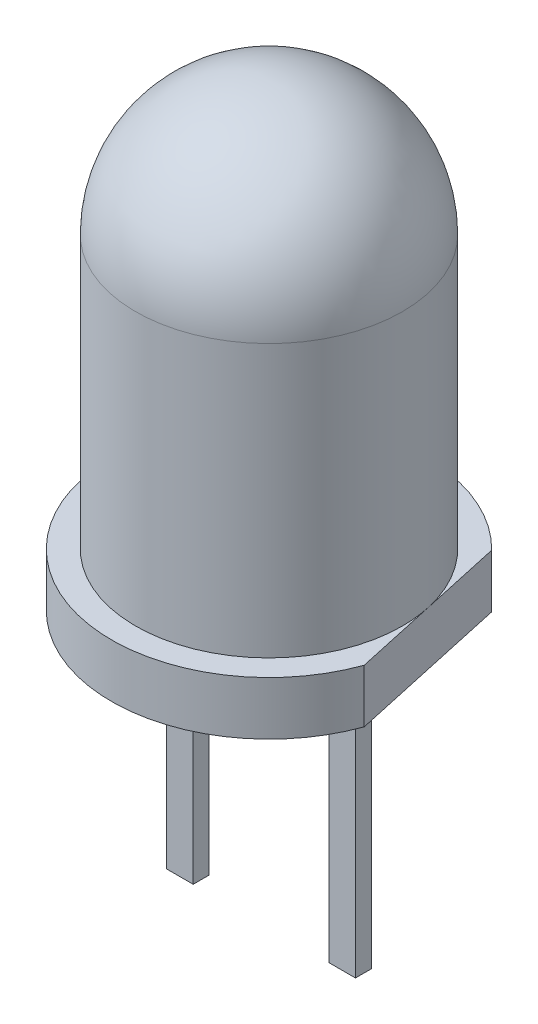
ISO-10303-21;
HEADER;
FILE_DESCRIPTION(('STEP AP214'),'2;1');
FILE_NAME('part.step','',(''),(''),'','','');
FILE_SCHEMA(('AUTOMOTIVE_DESIGN { 1 0 10303 214 1 1 1 1 }'));
ENDSEC;
DATA;
#1=APPLICATION_CONTEXT('core data for automotive mechanical design processes');
#2=APPLICATION_PROTOCOL_DEFINITION('international standard','automotive_design',2000,#1);
#3=PRODUCT_CONTEXT('',#1,'mechanical');
#4=PRODUCT('Part','Part','',(#3));
#5=PRODUCT_RELATED_PRODUCT_CATEGORY('part','',(#4));
#6=PRODUCT_DEFINITION_FORMATION('','',#4);
#7=PRODUCT_DEFINITION_CONTEXT('part definition',#1,'design');
#8=PRODUCT_DEFINITION('design','',#6,#7);
#9=PRODUCT_DEFINITION_SHAPE('','',#8);
#10=(LENGTH_UNIT() NAMED_UNIT(*) SI_UNIT(.MILLI.,.METRE.));
#11=(NAMED_UNIT(*) PLANE_ANGLE_UNIT() SI_UNIT($,.RADIAN.));
#12=(NAMED_UNIT(*) SI_UNIT($,.STERADIAN.) SOLID_ANGLE_UNIT());
#13=UNCERTAINTY_MEASURE_WITH_UNIT(LENGTH_MEASURE(1.E-05),#10,'distance_accuracy_value','');
#14=(GEOMETRIC_REPRESENTATION_CONTEXT(3) GLOBAL_UNCERTAINTY_ASSIGNED_CONTEXT((#13)) GLOBAL_UNIT_ASSIGNED_CONTEXT((#10,
#11,#12)) REPRESENTATION_CONTEXT('',''));
#15=CARTESIAN_POINT('',(0.,0.,0.));
#16=DIRECTION('',(0.,0.,1.));
#17=DIRECTION('',(1.,0.,0.));
#18=AXIS2_PLACEMENT_3D('',#15,#16,#17);
#19=CARTESIAN_POINT('',(0.,4.02324588999553,0.));
#20=DIRECTION('',(0.,-1.,0.));
#21=DIRECTION('',(1.,0.,0.));
#22=AXIS2_PLACEMENT_3D('',#19,#20,#21);
#23=SPHERICAL_SURFACE('',#22,2.5);
#24=CARTESIAN_POINT('',(0.,4.02324588999553,0.));
#25=DIRECTION('',(0.,-1.,0.));
#26=DIRECTION('',(1.,0.,0.));
#27=AXIS2_PLACEMENT_3D('',#24,#25,#26);
#28=CIRCLE('',#27,2.5);
#29=CARTESIAN_POINT('',(2.49999999999999,4.02324588999554,0.));
#30=VERTEX_POINT('',#29);
#31=EDGE_CURVE('E11',#30,#30,#28,.T.);
#32=ORIENTED_EDGE('',*,*,#31,.F.);
#33=EDGE_LOOP('',(#32));
#34=FACE_BOUND('',#33,.T.);
#35=ADVANCED_FACE('F33',(#34),#23,.T.);
#36=CARTESIAN_POINT('',(5.93600389952967E-13,-170.013908809735,0.));
#37=DIRECTION('',(0.,-1.,0.));
#38=DIRECTION('',(1.,0.,0.));
#39=AXIS2_PLACEMENT_3D('',#36,#37,#38);
#40=CYLINDRICAL_SURFACE('',#39,2.5);
#41=ORIENTED_EDGE('',*,*,#31,.T.);
#42=EDGE_LOOP('',(#41));
#43=FACE_BOUND('',#42,.T.);
#44=CARTESIAN_POINT('',(0.,-1.07675411000444,0.));
#45=DIRECTION('',(0.,-1.,0.));
#46=DIRECTION('',(1.,0.,0.));
#47=AXIS2_PLACEMENT_3D('',#44,#45,#46);
#48=CIRCLE('',#47,2.5);
#49=CARTESIAN_POINT('',(2.44180027093455,-1.07675411000444,-0.53629417008203));
#50=VERTEX_POINT('',#49);
#51=EDGE_CURVE('E40',#50,#50,#48,.T.);
#52=ORIENTED_EDGE('',*,*,#51,.F.);
#53=EDGE_LOOP('',(#52));
#54=FACE_BOUND('',#53,.T.);
#55=ADVANCED_FACE('F191',(#43,#54),#40,.T.);
#56=CARTESIAN_POINT('',(0.,-1.07675411000445,0.));
#57=DIRECTION('',(0.,-1.,0.));
#58=DIRECTION('',(1.,0.,0.));
#59=AXIS2_PLACEMENT_3D('',#56,#57,#58);
#60=PLANE('',#59);
#61=DIRECTION('',(0.214517668032812,0.,0.976720108373819));
#62=VECTOR('',#61,1.);
#63=CARTESIAN_POINT('',(2.10585574005865,-1.07675411000444,-2.06588276580789));
#64=LINE('',#63,#62);
#65=CARTESIAN_POINT('',(2.77774480181044,-1.07675411000444,0.993294425643827));
#66=VERTEX_POINT('',#65);
#67=EDGE_CURVE('E178',#50,#66,#64,.T.);
#68=ORIENTED_EDGE('',*,*,#67,.F.);
#69=ORIENTED_EDGE('',*,*,#51,.T.);
#70=CARTESIAN_POINT('',(2.10585574005865,-1.07675411000444,-2.06588276580789));
#71=VERTEX_POINT('',#70);
#72=EDGE_CURVE('E173',#71,#50,#64,.T.);
#73=ORIENTED_EDGE('',*,*,#72,.F.);
#74=CARTESIAN_POINT('',(0.,-1.07675411000445,0.));
#75=DIRECTION('',(0.,-1.,0.));
#76=DIRECTION('',(1.,0.,0.));
#77=AXIS2_PLACEMENT_3D('',#74,#75,#76);
#78=CIRCLE('',#77,2.95);
#79=EDGE_CURVE('E168',#66,#71,#78,.T.);
#80=ORIENTED_EDGE('',*,*,#79,.F.);
#81=EDGE_LOOP('',(#68,#69,#73,#80));
#82=FACE_BOUND('',#81,.T.);
#83=ADVANCED_FACE('F188',(#82),#60,.F.);
#84=CARTESIAN_POINT('',(0.,-2.07675411000445,0.));
#85=DIRECTION('',(0.,1.,0.));
#86=DIRECTION('',(-1.,0.,0.));
#87=AXIS2_PLACEMENT_3D('',#84,#85,#86);
#88=CYLINDRICAL_SURFACE('',#87,2.95);
#89=ORIENTED_EDGE('',*,*,#79,.T.);
#90=DIRECTION('',(0.,1.,0.));
#91=VECTOR('',#90,1.);
#92=CARTESIAN_POINT('',(2.10585574005866,-2.07675411000444,-2.06588276580789));
#93=LINE('',#92,#91);
#94=CARTESIAN_POINT('',(2.10585574005866,-2.07675411000444,-2.06588276580789));
#95=VERTEX_POINT('',#94);
#96=EDGE_CURVE('E183',#95,#71,#93,.T.);
#97=ORIENTED_EDGE('',*,*,#96,.F.);
#98=CARTESIAN_POINT('',(0.,-2.07675411000445,0.));
#99=DIRECTION('',(0.,-1.,0.));
#100=DIRECTION('',(1.,0.,0.));
#101=AXIS2_PLACEMENT_3D('',#98,#99,#100);
#102=CIRCLE('',#101,2.95);
#103=CARTESIAN_POINT('',(2.77774480181044,-2.07675411000444,0.993294425643827));
#104=VERTEX_POINT('',#103);
#105=EDGE_CURVE('E169',#104,#95,#102,.T.);
#106=ORIENTED_EDGE('',*,*,#105,.F.);
#107=DIRECTION('',(0.,1.,0.));
#108=VECTOR('',#107,1.);
#109=CARTESIAN_POINT('',(2.77774480181044,-2.07675411000444,0.993294425643827));
#110=LINE('',#109,#108);
#111=EDGE_CURVE('E175',#104,#66,#110,.T.);
#112=ORIENTED_EDGE('',*,*,#111,.T.);
#113=EDGE_LOOP('',(#89,#97,#106,#112));
#114=FACE_BOUND('',#113,.T.);
#115=ADVANCED_FACE('F198',(#114),#88,.T.);
#116=CARTESIAN_POINT('',(2.10585574005866,-2.07675411000444,-2.06588276580789));
#117=DIRECTION('',(-0.976720108373819,0.,0.214517668032812));
#118=DIRECTION('',(0.214517668032812,0.,0.976720108373819));
#119=AXIS2_PLACEMENT_3D('',#116,#117,#118);
#120=PLANE('',#119);
#121=ORIENTED_EDGE('',*,*,#72,.T.);
#122=ORIENTED_EDGE('',*,*,#67,.T.);
#123=ORIENTED_EDGE('',*,*,#111,.F.);
#124=DIRECTION('',(0.214517668032812,0.,0.976720108373819));
#125=VECTOR('',#124,1.);
#126=CARTESIAN_POINT('',(2.10585574005866,-2.07675411000444,-2.06588276580789));
#127=LINE('',#126,#125);
#128=EDGE_CURVE('E172',#95,#104,#127,.T.);
#129=ORIENTED_EDGE('',*,*,#128,.F.);
#130=ORIENTED_EDGE('',*,*,#96,.T.);
#131=EDGE_LOOP('',(#121,#122,#123,#129,#130));
#132=FACE_BOUND('',#131,.T.);
#133=ADVANCED_FACE('F204',(#132),#120,.F.);
#134=CARTESIAN_POINT('',(0.,-2.07675411000445,0.));
#135=DIRECTION('',(0.,-1.,0.));
#136=DIRECTION('',(1.,0.,0.));
#137=AXIS2_PLACEMENT_3D('',#134,#135,#136);
#138=PLANE('',#137);
#139=DIRECTION('',(-1.,0.,0.));
#140=VECTOR('',#139,1.);
#141=CARTESIAN_POINT('',(-1.27000000000329,-2.07675411000446,0.15));
#142=LINE('',#141,#140);
#143=CARTESIAN_POINT('',(-1.27000000000329,-2.07675411000446,0.15));
#144=VERTEX_POINT('',#143);
#145=CARTESIAN_POINT('',(-1.77000000000329,-2.07675411000446,0.15));
#146=VERTEX_POINT('',#145);
#147=EDGE_CURVE('E119',#144,#146,#142,.T.);
#148=ORIENTED_EDGE('',*,*,#147,.F.);
#149=DIRECTION('',(0.,0.,-1.));
#150=VECTOR('',#149,1.);
#151=CARTESIAN_POINT('',(-1.27000000000329,-2.07675411000446,0.15));
#152=LINE('',#151,#150);
#153=CARTESIAN_POINT('',(-1.27000000000329,-2.07675411000446,-0.15));
#154=VERTEX_POINT('',#153);
#155=EDGE_CURVE('E343',#144,#154,#152,.T.);
#156=ORIENTED_EDGE('',*,*,#155,.T.);
#157=DIRECTION('',(-1.,0.,0.));
#158=VECTOR('',#157,1.);
#159=CARTESIAN_POINT('',(-1.27000000000329,-2.07675411000446,-0.15));
#160=LINE('',#159,#158);
#161=CARTESIAN_POINT('',(-1.77000000000329,-2.07675411000445,-0.15));
#162=VERTEX_POINT('',#161);
#163=EDGE_CURVE('E134',#154,#162,#160,.T.);
#164=ORIENTED_EDGE('',*,*,#163,.T.);
#165=DIRECTION('',(0.,0.,-1.));
#166=VECTOR('',#165,1.);
#167=CARTESIAN_POINT('',(-1.77000000000329,-2.07675411000446,0.15));
#168=LINE('',#167,#166);
#169=EDGE_CURVE('E47',#146,#162,#168,.T.);
#170=ORIENTED_EDGE('',*,*,#169,.F.);
#171=EDGE_LOOP('',(#148,#156,#164,#170));
#172=FACE_BOUND('',#171,.T.);
#173=DIRECTION('',(-1.,0.,0.));
#174=VECTOR('',#173,1.);
#175=CARTESIAN_POINT('',(1.27000000000331,-2.07675411000446,0.15));
#176=LINE('',#175,#174);
#177=CARTESIAN_POINT('',(1.77000000000331,-2.07675411000446,0.15));
#178=VERTEX_POINT('',#177);
#179=CARTESIAN_POINT('',(1.27000000000331,-2.07675411000446,0.15));
#180=VERTEX_POINT('',#179);
#181=EDGE_CURVE('E150',#178,#180,#176,.T.);
#182=ORIENTED_EDGE('',*,*,#181,.F.);
#183=DIRECTION('',(0.,0.,-1.));
#184=VECTOR('',#183,1.);
#185=CARTESIAN_POINT('',(1.77000000000331,-2.07675411000446,0.15));
#186=LINE('',#185,#184);
#187=CARTESIAN_POINT('',(1.77000000000331,-2.07675411000446,-0.15));
#188=VERTEX_POINT('',#187);
#189=EDGE_CURVE('E159',#178,#188,#186,.T.);
#190=ORIENTED_EDGE('',*,*,#189,.T.);
#191=DIRECTION('',(-1.,0.,0.));
#192=VECTOR('',#191,1.);
#193=CARTESIAN_POINT('',(1.27000000000331,-2.07675411000446,-0.15));
#194=LINE('',#193,#192);
#195=CARTESIAN_POINT('',(1.27000000000331,-2.07675411000444,-0.15));
#196=VERTEX_POINT('',#195);
#197=EDGE_CURVE('E146',#188,#196,#194,.T.);
#198=ORIENTED_EDGE('',*,*,#197,.T.);
#199=DIRECTION('',(0.,0.,-1.));
#200=VECTOR('',#199,1.);
#201=CARTESIAN_POINT('',(1.27000000000331,-2.07675411000446,0.15));
#202=LINE('',#201,#200);
#203=EDGE_CURVE('E151',#180,#196,#202,.T.);
#204=ORIENTED_EDGE('',*,*,#203,.F.);
#205=EDGE_LOOP('',(#182,#190,#198,#204));
#206=FACE_BOUND('',#205,.T.);
#207=ORIENTED_EDGE('',*,*,#105,.T.);
#208=ORIENTED_EDGE('',*,*,#128,.T.);
#209=EDGE_LOOP('',(#207,#208));
#210=FACE_BOUND('',#209,.T.);
#211=ADVANCED_FACE('F131',(#172,#206,#210),#138,.T.);
#212=CARTESIAN_POINT('',(1.27000000000331,-2.07675411000446,0.15));
#213=DIRECTION('',(1.,0.,0.));
#214=DIRECTION('',(0.,1.,0.));
#215=AXIS2_PLACEMENT_3D('',#212,#213,#214);
#216=PLANE('',#215);
#217=DIRECTION('',(0.,-1.,0.));
#218=VECTOR('',#217,1.);
#219=CARTESIAN_POINT('',(1.27000000000331,-2.07675411000446,-0.15));
#220=LINE('',#219,#218);
#221=CARTESIAN_POINT('',(1.27000000000331,-7.07675411000446,-0.15));
#222=VERTEX_POINT('',#221);
#223=EDGE_CURVE('E55',#196,#222,#220,.T.);
#224=ORIENTED_EDGE('',*,*,#223,.T.);
#225=DIRECTION('',(0.,0.,-1.));
#226=VECTOR('',#225,1.);
#227=CARTESIAN_POINT('',(1.27000000000331,-7.07675411000446,0.15));
#228=LINE('',#227,#226);
#229=CARTESIAN_POINT('',(1.27000000000331,-7.07675411000446,0.15));
#230=VERTEX_POINT('',#229);
#231=EDGE_CURVE('E165',#230,#222,#228,.T.);
#232=ORIENTED_EDGE('',*,*,#231,.F.);
#233=DIRECTION('',(0.,-1.,0.));
#234=VECTOR('',#233,1.);
#235=CARTESIAN_POINT('',(1.27000000000331,-2.07675411000446,0.15));
#236=LINE('',#235,#234);
#237=EDGE_CURVE('E142',#180,#230,#236,.T.);
#238=ORIENTED_EDGE('',*,*,#237,.F.);
#239=ORIENTED_EDGE('',*,*,#203,.T.);
#240=EDGE_LOOP('',(#224,#232,#238,#239));
#241=FACE_BOUND('',#240,.T.);
#242=ADVANCED_FACE('F211',(#241),#216,.F.);
#243=CARTESIAN_POINT('',(1.27000000000331,-7.07675411000446,0.15));
#244=DIRECTION('',(0.,1.,0.));
#245=DIRECTION('',(0.,0.,1.));
#246=AXIS2_PLACEMENT_3D('',#243,#244,#245);
#247=PLANE('',#246);
#248=DIRECTION('',(1.,0.,0.));
#249=VECTOR('',#248,1.);
#250=CARTESIAN_POINT('',(1.27000000000331,-7.07675411000446,-0.15));
#251=LINE('',#250,#249);
#252=CARTESIAN_POINT('',(1.77000000000331,-7.07675411000446,-0.15));
#253=VERTEX_POINT('',#252);
#254=EDGE_CURVE('E136',#222,#253,#251,.T.);
#255=ORIENTED_EDGE('',*,*,#254,.T.);
#256=DIRECTION('',(0.,0.,-1.));
#257=VECTOR('',#256,1.);
#258=CARTESIAN_POINT('',(1.77000000000331,-7.07675411000446,0.15));
#259=LINE('',#258,#257);
#260=CARTESIAN_POINT('',(1.77000000000331,-7.07675411000446,0.15));
#261=VERTEX_POINT('',#260);
#262=EDGE_CURVE('E162',#261,#253,#259,.T.);
#263=ORIENTED_EDGE('',*,*,#262,.F.);
#264=DIRECTION('',(1.,0.,0.));
#265=VECTOR('',#264,1.);
#266=CARTESIAN_POINT('',(1.27000000000331,-7.07675411000446,0.15));
#267=LINE('',#266,#265);
#268=EDGE_CURVE('E145',#230,#261,#267,.T.);
#269=ORIENTED_EDGE('',*,*,#268,.F.);
#270=ORIENTED_EDGE('',*,*,#231,.T.);
#271=EDGE_LOOP('',(#255,#263,#269,#270));
#272=FACE_BOUND('',#271,.T.);
#273=ADVANCED_FACE('F214',(#272),#247,.F.);
#274=CARTESIAN_POINT('',(1.77000000000331,-2.07675411000446,0.15));
#275=DIRECTION('',(-1.,0.,0.));
#276=DIRECTION('',(0.,-1.,0.));
#277=AXIS2_PLACEMENT_3D('',#274,#275,#276);
#278=PLANE('',#277);
#279=DIRECTION('',(0.,1.,0.));
#280=VECTOR('',#279,1.);
#281=CARTESIAN_POINT('',(1.77000000000331,-2.07675411000446,-0.15));
#282=LINE('',#281,#280);
#283=EDGE_CURVE('E154',#253,#188,#282,.T.);
#284=ORIENTED_EDGE('',*,*,#283,.T.);
#285=ORIENTED_EDGE('',*,*,#189,.F.);
#286=DIRECTION('',(0.,1.,0.));
#287=VECTOR('',#286,1.);
#288=CARTESIAN_POINT('',(1.77000000000331,-2.07675411000446,0.15));
#289=LINE('',#288,#287);
#290=EDGE_CURVE('E148',#261,#178,#289,.T.);
#291=ORIENTED_EDGE('',*,*,#290,.F.);
#292=ORIENTED_EDGE('',*,*,#262,.T.);
#293=EDGE_LOOP('',(#284,#285,#291,#292));
#294=FACE_BOUND('',#293,.T.);
#295=ADVANCED_FACE('F218',(#294),#278,.F.);
#296=CARTESIAN_POINT('',(0.,0.,0.15));
#297=DIRECTION('',(0.,0.,1.));
#298=DIRECTION('',(1.,0.,0.));
#299=AXIS2_PLACEMENT_3D('',#296,#297,#298);
#300=PLANE('',#299);
#301=ORIENTED_EDGE('',*,*,#237,.T.);
#302=ORIENTED_EDGE('',*,*,#268,.T.);
#303=ORIENTED_EDGE('',*,*,#290,.T.);
#304=ORIENTED_EDGE('',*,*,#181,.T.);
#305=EDGE_LOOP('',(#301,#302,#303,#304));
#306=FACE_BOUND('',#305,.T.);
#307=ADVANCED_FACE('F222',(#306),#300,.T.);
#308=CARTESIAN_POINT('',(0.,0.,-0.15));
#309=DIRECTION('',(0.,0.,1.));
#310=DIRECTION('',(1.,0.,0.));
#311=AXIS2_PLACEMENT_3D('',#308,#309,#310);
#312=PLANE('',#311);
#313=ORIENTED_EDGE('',*,*,#223,.F.);
#314=ORIENTED_EDGE('',*,*,#197,.F.);
#315=ORIENTED_EDGE('',*,*,#283,.F.);
#316=ORIENTED_EDGE('',*,*,#254,.F.);
#317=EDGE_LOOP('',(#313,#314,#315,#316));
#318=FACE_BOUND('',#317,.T.);
#319=ADVANCED_FACE('F224',(#318),#312,.F.);
#320=CARTESIAN_POINT('',(-1.77000000000329,-2.07675411000446,0.15));
#321=DIRECTION('',(1.,0.,0.));
#322=DIRECTION('',(0.,1.,0.));
#323=AXIS2_PLACEMENT_3D('',#320,#321,#322);
#324=PLANE('',#323);
#325=DIRECTION('',(0.,-1.,0.));
#326=VECTOR('',#325,1.);
#327=CARTESIAN_POINT('',(-1.77000000000329,-2.07675411000446,-0.15));
#328=LINE('',#327,#326);
#329=CARTESIAN_POINT('',(-1.77000000000326,-7.07675411000446,-0.15));
#330=VERTEX_POINT('',#329);
#331=EDGE_CURVE('E341',#162,#330,#328,.T.);
#332=ORIENTED_EDGE('',*,*,#331,.T.);
#333=DIRECTION('',(0.,0.,-1.));
#334=VECTOR('',#333,1.);
#335=CARTESIAN_POINT('',(-1.77000000000326,-7.07675411000446,0.15));
#336=LINE('',#335,#334);
#337=CARTESIAN_POINT('',(-1.77000000000326,-7.07675411000446,0.15));
#338=VERTEX_POINT('',#337);
#339=EDGE_CURVE('E115',#338,#330,#336,.T.);
#340=ORIENTED_EDGE('',*,*,#339,.F.);
#341=DIRECTION('',(0.,-1.,0.));
#342=VECTOR('',#341,1.);
#343=CARTESIAN_POINT('',(-1.77000000000329,-2.07675411000446,0.15));
#344=LINE('',#343,#342);
#345=EDGE_CURVE('E111',#146,#338,#344,.T.);
#346=ORIENTED_EDGE('',*,*,#345,.F.);
#347=ORIENTED_EDGE('',*,*,#169,.T.);
#348=EDGE_LOOP('',(#332,#340,#346,#347));
#349=FACE_BOUND('',#348,.T.);
#350=ADVANCED_FACE('F113',(#349),#324,.F.);
#351=CARTESIAN_POINT('',(-1.27000000000326,-7.07675411000446,0.15));
#352=DIRECTION('',(0.,1.,0.));
#353=DIRECTION('',(0.,0.,1.));
#354=AXIS2_PLACEMENT_3D('',#351,#352,#353);
#355=PLANE('',#354);
#356=DIRECTION('',(1.,0.,0.));
#357=VECTOR('',#356,1.);
#358=CARTESIAN_POINT('',(-1.27000000000326,-7.07675411000446,-0.15));
#359=LINE('',#358,#357);
#360=CARTESIAN_POINT('',(-1.27000000000326,-7.07675411000446,-0.15));
#361=VERTEX_POINT('',#360);
#362=EDGE_CURVE('E349',#330,#361,#359,.T.);
#363=ORIENTED_EDGE('',*,*,#362,.T.);
#364=DIRECTION('',(0.,0.,-1.));
#365=VECTOR('',#364,1.);
#366=CARTESIAN_POINT('',(-1.27000000000326,-7.07675411000446,0.15));
#367=LINE('',#366,#365);
#368=CARTESIAN_POINT('',(-1.27000000000326,-7.07675411000446,0.15));
#369=VERTEX_POINT('',#368);
#370=EDGE_CURVE('E138',#369,#361,#367,.T.);
#371=ORIENTED_EDGE('',*,*,#370,.F.);
#372=DIRECTION('',(1.,0.,0.));
#373=VECTOR('',#372,1.);
#374=CARTESIAN_POINT('',(-1.27000000000326,-7.07675411000446,0.15));
#375=LINE('',#374,#373);
#376=EDGE_CURVE('E118',#338,#369,#375,.T.);
#377=ORIENTED_EDGE('',*,*,#376,.F.);
#378=ORIENTED_EDGE('',*,*,#339,.T.);
#379=EDGE_LOOP('',(#363,#371,#377,#378));
#380=FACE_BOUND('',#379,.T.);
#381=ADVANCED_FACE('F232',(#380),#355,.F.);
#382=CARTESIAN_POINT('',(-1.27000000000329,-2.07675411000446,0.15));
#383=DIRECTION('',(-1.,0.,0.));
#384=DIRECTION('',(0.,-1.,0.));
#385=AXIS2_PLACEMENT_3D('',#382,#383,#384);
#386=PLANE('',#385);
#387=DIRECTION('',(0.,1.,0.));
#388=VECTOR('',#387,1.);
#389=CARTESIAN_POINT('',(-1.27000000000329,-2.07675411000446,-0.15));
#390=LINE('',#389,#388);
#391=EDGE_CURVE('E128',#361,#154,#390,.T.);
#392=ORIENTED_EDGE('',*,*,#391,.T.);
#393=ORIENTED_EDGE('',*,*,#155,.F.);
#394=DIRECTION('',(0.,1.,0.));
#395=VECTOR('',#394,1.);
#396=CARTESIAN_POINT('',(-1.27000000000329,-2.07675411000446,0.15));
#397=LINE('',#396,#395);
#398=EDGE_CURVE('E124',#369,#144,#397,.T.);
#399=ORIENTED_EDGE('',*,*,#398,.F.);
#400=ORIENTED_EDGE('',*,*,#370,.T.);
#401=EDGE_LOOP('',(#392,#393,#399,#400));
#402=FACE_BOUND('',#401,.T.);
#403=ADVANCED_FACE('F235',(#402),#386,.F.);
#404=CARTESIAN_POINT('',(0.,0.,0.15));
#405=DIRECTION('',(0.,0.,1.));
#406=DIRECTION('',(1.,0.,0.));
#407=AXIS2_PLACEMENT_3D('',#404,#405,#406);
#408=PLANE('',#407);
#409=ORIENTED_EDGE('',*,*,#147,.T.);
#410=ORIENTED_EDGE('',*,*,#345,.T.);
#411=ORIENTED_EDGE('',*,*,#376,.T.);
#412=ORIENTED_EDGE('',*,*,#398,.T.);
#413=EDGE_LOOP('',(#409,#410,#411,#412));
#414=FACE_BOUND('',#413,.T.);
#415=ADVANCED_FACE('F122',(#414),#408,.T.);
#416=CARTESIAN_POINT('',(0.,0.,-0.15));
#417=DIRECTION('',(0.,0.,1.));
#418=DIRECTION('',(1.,0.,0.));
#419=AXIS2_PLACEMENT_3D('',#416,#417,#418);
#420=PLANE('',#419);
#421=ORIENTED_EDGE('',*,*,#163,.F.);
#422=ORIENTED_EDGE('',*,*,#391,.F.);
#423=ORIENTED_EDGE('',*,*,#362,.F.);
#424=ORIENTED_EDGE('',*,*,#331,.F.);
#425=EDGE_LOOP('',(#421,#422,#423,#424));
#426=FACE_BOUND('',#425,.T.);
#427=ADVANCED_FACE('F240',(#426),#420,.F.);
#428=CLOSED_SHELL('',(#35,#55,#83,#115,#133,#211,#242,#273,#295,#307,#319,#350,#381,#403,#415,#427));
#429=MANIFOLD_SOLID_BREP('B2',#428);
#430=ADVANCED_BREP_SHAPE_REPRESENTATION('',(#18,#429),#14);
#431=SHAPE_DEFINITION_REPRESENTATION(#9,#430);
ENDSEC;
END-ISO-10303-21;
